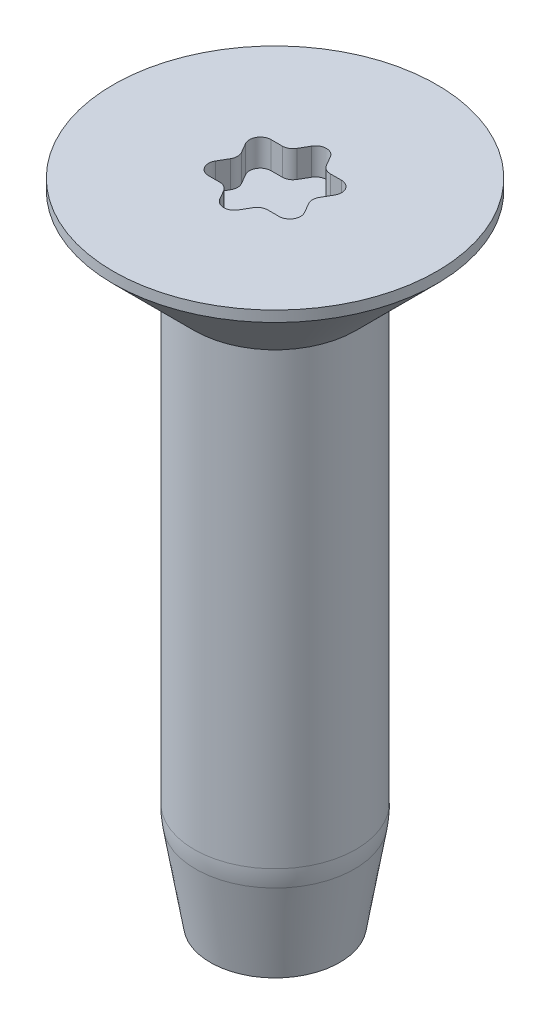
ISO-10303-21;
HEADER;
FILE_DESCRIPTION(('STEP AP214'),'2;1');
FILE_NAME('part.step','',(''),(''),'','','');
FILE_SCHEMA(('AUTOMOTIVE_DESIGN { 1 0 10303 214 1 1 1 1 }'));
ENDSEC;
DATA;
#1=APPLICATION_CONTEXT('core data for automotive mechanical design processes');
#2=APPLICATION_PROTOCOL_DEFINITION('international standard','automotive_design',2000,#1);
#3=PRODUCT_CONTEXT('',#1,'mechanical');
#4=PRODUCT('Part','Part','',(#3));
#5=PRODUCT_RELATED_PRODUCT_CATEGORY('part','',(#4));
#6=PRODUCT_DEFINITION_FORMATION('','',#4);
#7=PRODUCT_DEFINITION_CONTEXT('part definition',#1,'design');
#8=PRODUCT_DEFINITION('design','',#6,#7);
#9=PRODUCT_DEFINITION_SHAPE('','',#8);
#10=(LENGTH_UNIT() NAMED_UNIT(*) SI_UNIT(.MILLI.,.METRE.));
#11=(NAMED_UNIT(*) PLANE_ANGLE_UNIT() SI_UNIT($,.RADIAN.));
#12=(NAMED_UNIT(*) SI_UNIT($,.STERADIAN.) SOLID_ANGLE_UNIT());
#13=UNCERTAINTY_MEASURE_WITH_UNIT(LENGTH_MEASURE(1.E-05),#10,'distance_accuracy_value','');
#14=(GEOMETRIC_REPRESENTATION_CONTEXT(3) GLOBAL_UNCERTAINTY_ASSIGNED_CONTEXT((#13)) GLOBAL_UNIT_ASSIGNED_CONTEXT((#10,
#11,#12)) REPRESENTATION_CONTEXT('',''));
#15=CARTESIAN_POINT('',(0.,0.,0.));
#16=DIRECTION('',(0.,0.,1.));
#17=DIRECTION('',(1.,0.,0.));
#18=AXIS2_PLACEMENT_3D('',#15,#16,#17);
#19=CARTESIAN_POINT('',(0.,-26.5426406871193,0.));
#20=DIRECTION('',(0.,1.,0.));
#21=DIRECTION('',(0.,0.,1.));
#22=AXIS2_PLACEMENT_3D('',#19,#20,#21);
#23=CYLINDRICAL_SURFACE('',#22,1.5);
#24=CARTESIAN_POINT('',(0.,-8.33447493940356,0.));
#25=DIRECTION('',(0.,-1.,0.));
#26=DIRECTION('',(1.,0.,0.));
#27=AXIS2_PLACEMENT_3D('',#24,#25,#26);
#28=CIRCLE('',#27,1.5);
#29=CARTESIAN_POINT('',(1.5,-8.33447493940356,0.));
#30=VERTEX_POINT('',#29);
#31=EDGE_CURVE('E43',#30,#30,#28,.F.);
#32=ORIENTED_EDGE('',*,*,#31,.T.);
#33=EDGE_LOOP('',(#32));
#34=FACE_BOUND('',#33,.T.);
#35=CARTESIAN_POINT('',(0.,0.,0.));
#36=DIRECTION('',(0.,-1.,0.));
#37=DIRECTION('',(0.,0.,-1.));
#38=AXIS2_PLACEMENT_3D('',#35,#36,#37);
#39=CIRCLE('',#38,1.5);
#40=CARTESIAN_POINT('',(0.,0.,-1.5));
#41=VERTEX_POINT('',#40);
#42=EDGE_CURVE('E238',#41,#41,#39,.T.);
#43=ORIENTED_EDGE('',*,*,#42,.T.);
#44=EDGE_LOOP('',(#43));
#45=FACE_BOUND('',#44,.T.);
#46=ADVANCED_FACE('F35',(#34,#45),#23,.T.);
#47=CARTESIAN_POINT('',(0.,1.7,0.));
#48=DIRECTION('',(0.,-1.,0.));
#49=DIRECTION('',(0.,0.,-1.));
#50=AXIS2_PLACEMENT_3D('',#47,#48,#49);
#51=PLANE('',#50);
#52=DIRECTION('',(0.5,0.,-0.866025403784439));
#53=VECTOR('',#52,1.);
#54=CARTESIAN_POINT('',(1.,1.7,-0.58));
#55=LINE('',#54,#53);
#56=CARTESIAN_POINT('',(0.72287187078898,1.7,-0.0999999999999997));
#57=VERTEX_POINT('',#56);
#58=CARTESIAN_POINT('',(0.826794919243113,1.7,-0.28));
#59=VERTEX_POINT('',#58);
#60=EDGE_CURVE('E226',#57,#59,#55,.T.);
#61=ORIENTED_EDGE('',*,*,#60,.F.);
#62=CARTESIAN_POINT('',(0.896076951545868,1.7,0.));
#63=DIRECTION('',(0.,-1.,0.));
#64=DIRECTION('',(0.,0.,-1.));
#65=AXIS2_PLACEMENT_3D('',#62,#63,#64);
#66=CIRCLE('',#65,0.2);
#67=CARTESIAN_POINT('',(0.72287187078898,1.7,0.1));
#68=VERTEX_POINT('',#67);
#69=EDGE_CURVE('E272',#57,#68,#66,.F.);
#70=ORIENTED_EDGE('',*,*,#69,.T.);
#71=DIRECTION('',(-0.5,0.,-0.866025403784439));
#72=VECTOR('',#71,1.);
#73=CARTESIAN_POINT('',(0.665136843870018,1.7,0.));
#74=LINE('',#73,#72);
#75=CARTESIAN_POINT('',(0.826794919243113,1.7,0.28));
#76=VERTEX_POINT('',#75);
#77=EDGE_CURVE('E231',#76,#68,#74,.T.);
#78=ORIENTED_EDGE('',*,*,#77,.F.);
#79=CARTESIAN_POINT('',(0.653589838486225,1.7,0.38));
#80=DIRECTION('',(0.,-1.,0.));
#81=DIRECTION('',(0.,0.,-1.));
#82=AXIS2_PLACEMENT_3D('',#79,#80,#81);
#83=CIRCLE('',#82,0.2);
#84=CARTESIAN_POINT('',(0.653589838486225,1.7,0.58));
#85=VERTEX_POINT('',#84);
#86=EDGE_CURVE('E323',#76,#85,#83,.T.);
#87=ORIENTED_EDGE('',*,*,#86,.T.);
#88=DIRECTION('',(1.,0.,0.));
#89=VECTOR('',#88,1.);
#90=CARTESIAN_POINT('',(0.330273687740034,1.7,0.58));
#91=LINE('',#90,#89);
#92=CARTESIAN_POINT('',(0.445743741577959,1.7,0.58));
#93=VERTEX_POINT('',#92);
#94=EDGE_CURVE('E483',#93,#85,#91,.T.);
#95=ORIENTED_EDGE('',*,*,#94,.F.);
#96=CARTESIAN_POINT('',(0.445743741577959,1.7,0.78));
#97=DIRECTION('',(0.,-1.,0.));
#98=DIRECTION('',(0.,0.,-1.));
#99=AXIS2_PLACEMENT_3D('',#96,#97,#98);
#100=CIRCLE('',#99,0.2);
#101=CARTESIAN_POINT('',(0.272538660821072,1.7,0.68));
#102=VERTEX_POINT('',#101);
#103=EDGE_CURVE('E270',#93,#102,#100,.F.);
#104=ORIENTED_EDGE('',*,*,#103,.T.);
#105=DIRECTION('',(0.499999999999999,0.,-0.866025403784439));
#106=VECTOR('',#105,1.);
#107=CARTESIAN_POINT('',(0.330273687740034,1.7,0.58));
#108=LINE('',#107,#106);
#109=CARTESIAN_POINT('',(0.173205080756888,1.7,0.852050807568877));
#110=VERTEX_POINT('',#109);
#111=EDGE_CURVE('E480',#110,#102,#108,.T.);
#112=ORIENTED_EDGE('',*,*,#111,.F.);
#113=CARTESIAN_POINT('',(0.,1.7,0.752050807568877));
#114=DIRECTION('',(0.,-1.,0.));
#115=DIRECTION('',(0.,0.,-1.));
#116=AXIS2_PLACEMENT_3D('',#113,#114,#115);
#117=CIRCLE('',#116,0.2);
#118=CARTESIAN_POINT('',(-0.173205080756887,1.7,0.852050807568877));
#119=VERTEX_POINT('',#118);
#120=EDGE_CURVE('E327',#110,#119,#117,.T.);
#121=ORIENTED_EDGE('',*,*,#120,.T.);
#122=DIRECTION('',(0.5,0.,0.866025403784439));
#123=VECTOR('',#122,1.);
#124=CARTESIAN_POINT('',(-0.330273687740034,1.7,0.58));
#125=LINE('',#124,#123);
#126=CARTESIAN_POINT('',(-0.272538660821071,1.7,0.68));
#127=VERTEX_POINT('',#126);
#128=EDGE_CURVE('E477',#127,#119,#125,.T.);
#129=ORIENTED_EDGE('',*,*,#128,.F.);
#130=CARTESIAN_POINT('',(-0.445743741577959,1.7,0.78));
#131=DIRECTION('',(0.,-1.,0.));
#132=DIRECTION('',(0.,0.,-1.));
#133=AXIS2_PLACEMENT_3D('',#130,#131,#132);
#134=CIRCLE('',#133,0.2);
#135=CARTESIAN_POINT('',(-0.445743741577959,1.7,0.58));
#136=VERTEX_POINT('',#135);
#137=EDGE_CURVE('E268',#127,#136,#134,.F.);
#138=ORIENTED_EDGE('',*,*,#137,.T.);
#139=DIRECTION('',(1.,0.,0.));
#140=VECTOR('',#139,1.);
#141=CARTESIAN_POINT('',(-1.,1.7,0.58));
#142=LINE('',#141,#140);
#143=CARTESIAN_POINT('',(-0.653589838486224,1.7,0.58));
#144=VERTEX_POINT('',#143);
#145=EDGE_CURVE('E474',#144,#136,#142,.T.);
#146=ORIENTED_EDGE('',*,*,#145,.F.);
#147=CARTESIAN_POINT('',(-0.653589838486224,1.7,0.38));
#148=DIRECTION('',(0.,-1.,0.));
#149=DIRECTION('',(0.,0.,-1.));
#150=AXIS2_PLACEMENT_3D('',#147,#148,#149);
#151=CIRCLE('',#150,0.2);
#152=CARTESIAN_POINT('',(-0.826794919243112,1.7,0.28));
#153=VERTEX_POINT('',#152);
#154=EDGE_CURVE('E331',#144,#153,#151,.T.);
#155=ORIENTED_EDGE('',*,*,#154,.T.);
#156=DIRECTION('',(-0.5,0.,0.866025403784439));
#157=VECTOR('',#156,1.);
#158=CARTESIAN_POINT('',(-0.665136843870017,1.7,0.));
#159=LINE('',#158,#157);
#160=CARTESIAN_POINT('',(-0.722871870788979,1.7,0.0999999999999998));
#161=VERTEX_POINT('',#160);
#162=EDGE_CURVE('E471',#161,#153,#159,.T.);
#163=ORIENTED_EDGE('',*,*,#162,.F.);
#164=CARTESIAN_POINT('',(-0.896076951545867,1.7,0.));
#165=DIRECTION('',(0.,-1.,0.));
#166=DIRECTION('',(0.,0.,-1.));
#167=AXIS2_PLACEMENT_3D('',#164,#165,#166);
#168=CIRCLE('',#167,0.2);
#169=CARTESIAN_POINT('',(-0.722871870788979,1.7,-0.1));
#170=VERTEX_POINT('',#169);
#171=EDGE_CURVE('E50',#161,#170,#168,.F.);
#172=ORIENTED_EDGE('',*,*,#171,.T.);
#173=DIRECTION('',(0.5,0.,0.866025403784439));
#174=VECTOR('',#173,1.);
#175=CARTESIAN_POINT('',(-0.999999999999999,1.7,-0.58));
#176=LINE('',#175,#174);
#177=CARTESIAN_POINT('',(-0.826794919243112,1.7,-0.28));
#178=VERTEX_POINT('',#177);
#179=EDGE_CURVE('E469',#178,#170,#176,.T.);
#180=ORIENTED_EDGE('',*,*,#179,.F.);
#181=CARTESIAN_POINT('',(-0.653589838486224,1.7,-0.38));
#182=DIRECTION('',(0.,-1.,0.));
#183=DIRECTION('',(0.,0.,-1.));
#184=AXIS2_PLACEMENT_3D('',#181,#182,#183);
#185=CIRCLE('',#184,0.2);
#186=CARTESIAN_POINT('',(-0.653589838486224,1.7,-0.58));
#187=VERTEX_POINT('',#186);
#188=EDGE_CURVE('E58',#178,#187,#185,.T.);
#189=ORIENTED_EDGE('',*,*,#188,.T.);
#190=DIRECTION('',(-1.,0.,0.));
#191=VECTOR('',#190,1.);
#192=CARTESIAN_POINT('',(-0.999999999999999,1.7,-0.58));
#193=LINE('',#192,#191);
#194=CARTESIAN_POINT('',(-0.44574374157796,1.7,-0.58));
#195=VERTEX_POINT('',#194);
#196=EDGE_CURVE('E466',#195,#187,#193,.T.);
#197=ORIENTED_EDGE('',*,*,#196,.F.);
#198=CARTESIAN_POINT('',(-0.445743741577959,1.7,-0.78));
#199=DIRECTION('',(0.,-1.,0.));
#200=DIRECTION('',(0.,0.,-1.));
#201=AXIS2_PLACEMENT_3D('',#198,#199,#200);
#202=CIRCLE('',#201,0.2);
#203=CARTESIAN_POINT('',(-0.272538660821072,1.7,-0.68));
#204=VERTEX_POINT('',#203);
#205=EDGE_CURVE('E264',#195,#204,#202,.F.);
#206=ORIENTED_EDGE('',*,*,#205,.T.);
#207=DIRECTION('',(-0.5,0.,0.866025403784439));
#208=VECTOR('',#207,1.);
#209=CARTESIAN_POINT('',(0.,1.7,-1.15205080756888));
#210=LINE('',#209,#208);
#211=CARTESIAN_POINT('',(-0.173205080756888,1.7,-0.852050807568877));
#212=VERTEX_POINT('',#211);
#213=EDGE_CURVE('E464',#212,#204,#210,.T.);
#214=ORIENTED_EDGE('',*,*,#213,.F.);
#215=CARTESIAN_POINT('',(0.,1.7,-0.752050807568877));
#216=DIRECTION('',(0.,-1.,0.));
#217=DIRECTION('',(0.,0.,-1.));
#218=AXIS2_PLACEMENT_3D('',#215,#216,#217);
#219=CIRCLE('',#218,0.2);
#220=CARTESIAN_POINT('',(0.173205080756888,1.7,-0.852050807568877));
#221=VERTEX_POINT('',#220);
#222=EDGE_CURVE('E338',#212,#221,#219,.T.);
#223=ORIENTED_EDGE('',*,*,#222,.T.);
#224=DIRECTION('',(-0.5,0.,-0.866025403784439));
#225=VECTOR('',#224,1.);
#226=CARTESIAN_POINT('',(0.,1.7,-1.15205080756888));
#227=LINE('',#226,#225);
#228=CARTESIAN_POINT('',(0.272538660821072,1.7,-0.68));
#229=VERTEX_POINT('',#228);
#230=EDGE_CURVE('E225',#229,#221,#227,.T.);
#231=ORIENTED_EDGE('',*,*,#230,.F.);
#232=CARTESIAN_POINT('',(0.445743741577959,1.7,-0.78));
#233=DIRECTION('',(0.,-1.,0.));
#234=DIRECTION('',(0.,0.,-1.));
#235=AXIS2_PLACEMENT_3D('',#232,#233,#234);
#236=CIRCLE('',#235,0.2);
#237=CARTESIAN_POINT('',(0.445743741577959,1.7,-0.58));
#238=VERTEX_POINT('',#237);
#239=EDGE_CURVE('E224',#229,#238,#236,.F.);
#240=ORIENTED_EDGE('',*,*,#239,.T.);
#241=DIRECTION('',(-1.,0.,0.));
#242=VECTOR('',#241,1.);
#243=CARTESIAN_POINT('',(0.330273687740034,1.7,-0.58));
#244=LINE('',#243,#242);
#245=CARTESIAN_POINT('',(0.653589838486225,1.7,-0.58));
#246=VERTEX_POINT('',#245);
#247=EDGE_CURVE('E214',#246,#238,#244,.T.);
#248=ORIENTED_EDGE('',*,*,#247,.F.);
#249=CARTESIAN_POINT('',(0.653589838486225,1.7,-0.38));
#250=DIRECTION('',(0.,-1.,0.));
#251=DIRECTION('',(0.,0.,-1.));
#252=AXIS2_PLACEMENT_3D('',#249,#250,#251);
#253=CIRCLE('',#252,0.2);
#254=EDGE_CURVE('E198',#246,#59,#253,.T.);
#255=ORIENTED_EDGE('',*,*,#254,.T.);
#256=EDGE_LOOP('',(#61,#70,#78,#87,#95,#104,#112,#121,#129,#138,#146,#155,#163,#172,#180,#189,
#197,#206,#214,#223,#231,#240,#248,#255));
#257=FACE_BOUND('',#256,.T.);
#258=CARTESIAN_POINT('',(0.,1.7,0.));
#259=DIRECTION('',(0.,1.,0.));
#260=DIRECTION('',(0.,0.,1.));
#261=AXIS2_PLACEMENT_3D('',#258,#259,#260);
#262=CIRCLE('',#261,3.);
#263=CARTESIAN_POINT('',(0.,1.7,3.));
#264=VERTEX_POINT('',#263);
#265=EDGE_CURVE('E245',#264,#264,#262,.T.);
#266=ORIENTED_EDGE('',*,*,#265,.T.);
#267=EDGE_LOOP('',(#266));
#268=FACE_BOUND('',#267,.T.);
#269=ADVANCED_FACE('F221',(#257,#268),#51,.F.);
#270=CARTESIAN_POINT('',(0.,50.,0.));
#271=DIRECTION('',(0.,1.,0.));
#272=DIRECTION('',(0.,0.,1.));
#273=AXIS2_PLACEMENT_3D('',#270,#271,#272);
#274=CYLINDRICAL_SURFACE('',#273,3.);
#275=ORIENTED_EDGE('',*,*,#265,.F.);
#276=EDGE_LOOP('',(#275));
#277=FACE_BOUND('',#276,.T.);
#278=CARTESIAN_POINT('',(0.,1.50000000000002,0.));
#279=DIRECTION('',(0.,1.,0.));
#280=DIRECTION('',(0.,0.,1.));
#281=AXIS2_PLACEMENT_3D('',#278,#279,#280);
#282=CIRCLE('',#281,3.);
#283=CARTESIAN_POINT('',(0.,1.50000000000002,3.));
#284=VERTEX_POINT('',#283);
#285=EDGE_CURVE('E242',#284,#284,#282,.T.);
#286=ORIENTED_EDGE('',*,*,#285,.T.);
#287=EDGE_LOOP('',(#286));
#288=FACE_BOUND('',#287,.T.);
#289=ADVANCED_FACE('F360',(#277,#288),#274,.T.);
#290=CARTESIAN_POINT('',(0.,0.,0.));
#291=DIRECTION('',(0.,1.,0.));
#292=DIRECTION('',(0.,0.,1.));
#293=AXIS2_PLACEMENT_3D('',#290,#291,#292);
#294=CONICAL_SURFACE('',#293,1.5,0.785398163397443);
#295=ORIENTED_EDGE('',*,*,#285,.F.);
#296=EDGE_LOOP('',(#295));
#297=FACE_BOUND('',#296,.T.);
#298=ORIENTED_EDGE('',*,*,#42,.F.);
#299=EDGE_LOOP('',(#298));
#300=FACE_BOUND('',#299,.T.);
#301=ADVANCED_FACE('F371',(#297,#300),#294,.T.);
#302=CARTESIAN_POINT('',(0.,-8.5,0.));
#303=DIRECTION('',(0.,1.,0.));
#304=DIRECTION('',(-1.,0.,0.));
#305=AXIS2_PLACEMENT_3D('',#302,#303,#304);
#306=CONICAL_SURFACE('',#305,1.5,0.165148677414627);
#307=CARTESIAN_POINT('',(0.,-8.66327291401428,0.));
#308=DIRECTION('',(0.,1.,0.));
#309=DIRECTION('',(-1.,0.,0.));
#310=AXIS2_PLACEMENT_3D('',#307,#308,#309);
#311=CIRCLE('',#310,1.47278784766429);
#312=CARTESIAN_POINT('',(-1.47278784766429,-8.66327291401428,0.));
#313=VERTEX_POINT('',#312);
#314=EDGE_CURVE('E12',#313,#313,#311,.F.);
#315=ORIENTED_EDGE('',*,*,#314,.T.);
#316=EDGE_LOOP('',(#315));
#317=FACE_BOUND('',#316,.T.);
#318=CARTESIAN_POINT('',(0.,-10.3,0.));
#319=DIRECTION('',(0.,1.,0.));
#320=DIRECTION('',(-1.,0.,0.));
#321=AXIS2_PLACEMENT_3D('',#318,#319,#320);
#322=CIRCLE('',#321,1.2);
#323=CARTESIAN_POINT('',(-1.2,-10.3,0.));
#324=VERTEX_POINT('',#323);
#325=EDGE_CURVE('E235',#324,#324,#322,.T.);
#326=ORIENTED_EDGE('',*,*,#325,.T.);
#327=EDGE_LOOP('',(#326));
#328=FACE_BOUND('',#327,.T.);
#329=ADVANCED_FACE('F364',(#317,#328),#306,.T.);
#330=CARTESIAN_POINT('',(0.,-10.3,0.));
#331=DIRECTION('',(0.,-1.,0.));
#332=DIRECTION('',(0.,0.,-1.));
#333=AXIS2_PLACEMENT_3D('',#330,#331,#332);
#334=PLANE('',#333);
#335=ORIENTED_EDGE('',*,*,#325,.F.);
#336=EDGE_LOOP('',(#335));
#337=FACE_BOUND('',#336,.T.);
#338=ADVANCED_FACE('F366',(#337),#334,.T.);
#339=CARTESIAN_POINT('',(0.,1.2,-1.15205080756888));
#340=DIRECTION('',(-0.866025403784439,0.,-0.5));
#341=DIRECTION('',(-0.5,0.,0.866025403784439));
#342=AXIS2_PLACEMENT_3D('',#339,#340,#341);
#343=PLANE('',#342);
#344=DIRECTION('',(-0.5,0.,0.866025403784439));
#345=VECTOR('',#344,1.);
#346=CARTESIAN_POINT('',(0.,1.2,-1.15205080756888));
#347=LINE('',#346,#345);
#348=CARTESIAN_POINT('',(-0.173205080756888,1.2,-0.852050807568877));
#349=VERTEX_POINT('',#348);
#350=CARTESIAN_POINT('',(-0.272538660821072,1.2,-0.68));
#351=VERTEX_POINT('',#350);
#352=EDGE_CURVE('E229',#349,#351,#347,.T.);
#353=ORIENTED_EDGE('',*,*,#352,.F.);
#354=DIRECTION('',(0.,1.,0.));
#355=VECTOR('',#354,1.);
#356=CARTESIAN_POINT('',(-0.173205080756888,1.7,-0.852050807568877));
#357=LINE('',#356,#355);
#358=EDGE_CURVE('E208',#349,#212,#357,.T.);
#359=ORIENTED_EDGE('',*,*,#358,.T.);
#360=ORIENTED_EDGE('',*,*,#213,.T.);
#361=DIRECTION('',(0.,1.,0.));
#362=VECTOR('',#361,1.);
#363=CARTESIAN_POINT('',(-0.272538660821072,1.2,-0.68));
#364=LINE('',#363,#362);
#365=EDGE_CURVE('E318',#204,#351,#364,.F.);
#366=ORIENTED_EDGE('',*,*,#365,.T.);
#367=EDGE_LOOP('',(#353,#359,#360,#366));
#368=FACE_BOUND('',#367,.T.);
#369=ADVANCED_FACE('F369',(#368),#343,.F.);
#370=CARTESIAN_POINT('',(0.,1.2,-1.15205080756888));
#371=DIRECTION('',(0.866025403784439,0.,-0.5));
#372=DIRECTION('',(-0.5,0.,-0.866025403784439));
#373=AXIS2_PLACEMENT_3D('',#370,#371,#372);
#374=PLANE('',#373);
#375=DIRECTION('',(-0.5,0.,-0.866025403784439));
#376=VECTOR('',#375,1.);
#377=CARTESIAN_POINT('',(0.,1.2,-1.15205080756888));
#378=LINE('',#377,#376);
#379=CARTESIAN_POINT('',(0.272538660821072,1.2,-0.68));
#380=VERTEX_POINT('',#379);
#381=CARTESIAN_POINT('',(0.173205080756888,1.2,-0.852050807568877));
#382=VERTEX_POINT('',#381);
#383=EDGE_CURVE('E239',#380,#382,#378,.T.);
#384=ORIENTED_EDGE('',*,*,#383,.F.);
#385=DIRECTION('',(0.,1.,0.));
#386=VECTOR('',#385,1.);
#387=CARTESIAN_POINT('',(0.272538660821072,1.2,-0.68));
#388=LINE('',#387,#386);
#389=EDGE_CURVE('E315',#380,#229,#388,.T.);
#390=ORIENTED_EDGE('',*,*,#389,.T.);
#391=ORIENTED_EDGE('',*,*,#230,.T.);
#392=DIRECTION('',(0.,1.,0.));
#393=VECTOR('',#392,1.);
#394=CARTESIAN_POINT('',(0.173205080756888,1.2,-0.852050807568877));
#395=LINE('',#394,#393);
#396=EDGE_CURVE('E313',#221,#382,#395,.F.);
#397=ORIENTED_EDGE('',*,*,#396,.T.);
#398=EDGE_LOOP('',(#384,#390,#391,#397));
#399=FACE_BOUND('',#398,.T.);
#400=ADVANCED_FACE('F505',(#399),#374,.F.);
#401=CARTESIAN_POINT('',(0.330273687740034,1.2,-0.58));
#402=DIRECTION('',(0.,0.,-1.));
#403=DIRECTION('',(-1.,0.,0.));
#404=AXIS2_PLACEMENT_3D('',#401,#402,#403);
#405=PLANE('',#404);
#406=DIRECTION('',(-1.,0.,0.));
#407=VECTOR('',#406,1.);
#408=CARTESIAN_POINT('',(0.330273687740034,1.2,-0.58));
#409=LINE('',#408,#407);
#410=CARTESIAN_POINT('',(0.653589838486225,1.2,-0.58));
#411=VERTEX_POINT('',#410);
#412=CARTESIAN_POINT('',(0.445743741577959,1.2,-0.58));
#413=VERTEX_POINT('',#412);
#414=EDGE_CURVE('E217',#411,#413,#409,.T.);
#415=ORIENTED_EDGE('',*,*,#414,.F.);
#416=DIRECTION('',(0.,1.,0.));
#417=VECTOR('',#416,1.);
#418=CARTESIAN_POINT('',(0.653589838486225,1.7,-0.58));
#419=LINE('',#418,#417);
#420=EDGE_CURVE('E202',#411,#246,#419,.T.);
#421=ORIENTED_EDGE('',*,*,#420,.T.);
#422=ORIENTED_EDGE('',*,*,#247,.T.);
#423=DIRECTION('',(0.,1.,0.));
#424=VECTOR('',#423,1.);
#425=CARTESIAN_POINT('',(0.445743741577959,1.2,-0.58));
#426=LINE('',#425,#424);
#427=EDGE_CURVE('E219',#238,#413,#426,.F.);
#428=ORIENTED_EDGE('',*,*,#427,.T.);
#429=EDGE_LOOP('',(#415,#421,#422,#428));
#430=FACE_BOUND('',#429,.T.);
#431=ADVANCED_FACE('F213',(#430),#405,.F.);
#432=CARTESIAN_POINT('',(1.,1.2,-0.58));
#433=DIRECTION('',(0.866025403784439,0.,0.5));
#434=DIRECTION('',(0.5,0.,-0.866025403784439));
#435=AXIS2_PLACEMENT_3D('',#432,#433,#434);
#436=PLANE('',#435);
#437=ORIENTED_EDGE('',*,*,#60,.T.);
#438=DIRECTION('',(0.,1.,0.));
#439=VECTOR('',#438,1.);
#440=CARTESIAN_POINT('',(0.826794919243113,1.2,-0.28));
#441=LINE('',#440,#439);
#442=CARTESIAN_POINT('',(0.826794919243113,1.2,-0.28));
#443=VERTEX_POINT('',#442);
#444=EDGE_CURVE('E203',#59,#443,#441,.F.);
#445=ORIENTED_EDGE('',*,*,#444,.T.);
#446=DIRECTION('',(0.5,0.,-0.866025403784439));
#447=VECTOR('',#446,1.);
#448=CARTESIAN_POINT('',(1.,1.2,-0.58));
#449=LINE('',#448,#447);
#450=CARTESIAN_POINT('',(0.72287187078898,1.2,-0.0999999999999997));
#451=VERTEX_POINT('',#450);
#452=EDGE_CURVE('E460',#451,#443,#449,.T.);
#453=ORIENTED_EDGE('',*,*,#452,.F.);
#454=DIRECTION('',(0.,1.,0.));
#455=VECTOR('',#454,1.);
#456=CARTESIAN_POINT('',(0.72287187078898,1.2,-0.0999999999999998));
#457=LINE('',#456,#455);
#458=EDGE_CURVE('E218',#451,#57,#457,.T.);
#459=ORIENTED_EDGE('',*,*,#458,.T.);
#460=EDGE_LOOP('',(#437,#445,#453,#459));
#461=FACE_BOUND('',#460,.T.);
#462=ADVANCED_FACE('F496',(#461),#436,.F.);
#463=CARTESIAN_POINT('',(0.665136843870018,1.2,0.));
#464=DIRECTION('',(0.866025403784439,0.,-0.5));
#465=DIRECTION('',(-0.5,0.,-0.866025403784439));
#466=AXIS2_PLACEMENT_3D('',#463,#464,#465);
#467=PLANE('',#466);
#468=ORIENTED_EDGE('',*,*,#77,.T.);
#469=DIRECTION('',(0.,1.,0.));
#470=VECTOR('',#469,1.);
#471=CARTESIAN_POINT('',(0.72287187078898,1.2,0.1));
#472=LINE('',#471,#470);
#473=CARTESIAN_POINT('',(0.72287187078898,1.2,0.1));
#474=VERTEX_POINT('',#473);
#475=EDGE_CURVE('E277',#68,#474,#472,.F.);
#476=ORIENTED_EDGE('',*,*,#475,.T.);
#477=DIRECTION('',(-0.5,0.,-0.866025403784439));
#478=VECTOR('',#477,1.);
#479=CARTESIAN_POINT('',(0.665136843870018,1.2,0.));
#480=LINE('',#479,#478);
#481=CARTESIAN_POINT('',(0.826794919243113,1.2,0.28));
#482=VERTEX_POINT('',#481);
#483=EDGE_CURVE('E457',#482,#474,#480,.T.);
#484=ORIENTED_EDGE('',*,*,#483,.F.);
#485=DIRECTION('',(0.,1.,0.));
#486=VECTOR('',#485,1.);
#487=CARTESIAN_POINT('',(0.826794919243113,1.7,0.28));
#488=LINE('',#487,#486);
#489=EDGE_CURVE('E274',#482,#76,#488,.T.);
#490=ORIENTED_EDGE('',*,*,#489,.T.);
#491=EDGE_LOOP('',(#468,#476,#484,#490));
#492=FACE_BOUND('',#491,.T.);
#493=ADVANCED_FACE('F489',(#492),#467,.F.);
#494=CARTESIAN_POINT('',(0.330273687740034,1.2,0.58));
#495=DIRECTION('',(0.,0.,1.));
#496=DIRECTION('',(1.,0.,0.));
#497=AXIS2_PLACEMENT_3D('',#494,#495,#496);
#498=PLANE('',#497);
#499=ORIENTED_EDGE('',*,*,#94,.T.);
#500=DIRECTION('',(0.,1.,0.));
#501=VECTOR('',#500,1.);
#502=CARTESIAN_POINT('',(0.653589838486225,1.2,0.58));
#503=LINE('',#502,#501);
#504=CARTESIAN_POINT('',(0.653589838486225,1.2,0.58));
#505=VERTEX_POINT('',#504);
#506=EDGE_CURVE('E282',#85,#505,#503,.F.);
#507=ORIENTED_EDGE('',*,*,#506,.T.);
#508=DIRECTION('',(1.,0.,0.));
#509=VECTOR('',#508,1.);
#510=CARTESIAN_POINT('',(0.330273687740034,1.2,0.58));
#511=LINE('',#510,#509);
#512=CARTESIAN_POINT('',(0.445743741577959,1.2,0.58));
#513=VERTEX_POINT('',#512);
#514=EDGE_CURVE('E454',#513,#505,#511,.T.);
#515=ORIENTED_EDGE('',*,*,#514,.F.);
#516=DIRECTION('',(0.,1.,0.));
#517=VECTOR('',#516,1.);
#518=CARTESIAN_POINT('',(0.445743741577959,1.2,0.58));
#519=LINE('',#518,#517);
#520=EDGE_CURVE('E279',#513,#93,#519,.T.);
#521=ORIENTED_EDGE('',*,*,#520,.T.);
#522=EDGE_LOOP('',(#499,#507,#515,#521));
#523=FACE_BOUND('',#522,.T.);
#524=ADVANCED_FACE('F503',(#523),#498,.F.);
#525=CARTESIAN_POINT('',(0.330273687740034,1.2,0.58));
#526=DIRECTION('',(0.866025403784439,0.,0.499999999999999));
#527=DIRECTION('',(0.499999999999999,0.,-0.866025403784439));
#528=AXIS2_PLACEMENT_3D('',#525,#526,#527);
#529=PLANE('',#528);
#530=ORIENTED_EDGE('',*,*,#111,.T.);
#531=DIRECTION('',(0.,1.,0.));
#532=VECTOR('',#531,1.);
#533=CARTESIAN_POINT('',(0.272538660821072,1.2,0.68));
#534=LINE('',#533,#532);
#535=CARTESIAN_POINT('',(0.272538660821072,1.2,0.68));
#536=VERTEX_POINT('',#535);
#537=EDGE_CURVE('E287',#102,#536,#534,.F.);
#538=ORIENTED_EDGE('',*,*,#537,.T.);
#539=DIRECTION('',(0.499999999999999,0.,-0.866025403784439));
#540=VECTOR('',#539,1.);
#541=CARTESIAN_POINT('',(0.330273687740034,1.2,0.58));
#542=LINE('',#541,#540);
#543=CARTESIAN_POINT('',(0.173205080756888,1.2,0.852050807568877));
#544=VERTEX_POINT('',#543);
#545=EDGE_CURVE('E451',#544,#536,#542,.T.);
#546=ORIENTED_EDGE('',*,*,#545,.F.);
#547=DIRECTION('',(0.,1.,0.));
#548=VECTOR('',#547,1.);
#549=CARTESIAN_POINT('',(0.173205080756888,1.7,0.852050807568877));
#550=LINE('',#549,#548);
#551=EDGE_CURVE('E284',#544,#110,#550,.T.);
#552=ORIENTED_EDGE('',*,*,#551,.T.);
#553=EDGE_LOOP('',(#530,#538,#546,#552));
#554=FACE_BOUND('',#553,.T.);
#555=ADVANCED_FACE('F511',(#554),#529,.F.);
#556=CARTESIAN_POINT('',(-0.330273687740034,1.2,0.58));
#557=DIRECTION('',(-0.866025403784439,0.,0.5));
#558=DIRECTION('',(0.5,0.,0.866025403784439));
#559=AXIS2_PLACEMENT_3D('',#556,#557,#558);
#560=PLANE('',#559);
#561=ORIENTED_EDGE('',*,*,#128,.T.);
#562=DIRECTION('',(0.,1.,0.));
#563=VECTOR('',#562,1.);
#564=CARTESIAN_POINT('',(-0.173205080756887,1.2,0.852050807568877));
#565=LINE('',#564,#563);
#566=CARTESIAN_POINT('',(-0.173205080756887,1.2,0.852050807568877));
#567=VERTEX_POINT('',#566);
#568=EDGE_CURVE('E292',#119,#567,#565,.F.);
#569=ORIENTED_EDGE('',*,*,#568,.T.);
#570=DIRECTION('',(0.5,0.,0.866025403784439));
#571=VECTOR('',#570,1.);
#572=CARTESIAN_POINT('',(-0.330273687740034,1.2,0.58));
#573=LINE('',#572,#571);
#574=CARTESIAN_POINT('',(-0.272538660821071,1.2,0.68));
#575=VERTEX_POINT('',#574);
#576=EDGE_CURVE('E448',#575,#567,#573,.T.);
#577=ORIENTED_EDGE('',*,*,#576,.F.);
#578=DIRECTION('',(0.,1.,0.));
#579=VECTOR('',#578,1.);
#580=CARTESIAN_POINT('',(-0.272538660821071,1.2,0.68));
#581=LINE('',#580,#579);
#582=EDGE_CURVE('E289',#575,#127,#581,.T.);
#583=ORIENTED_EDGE('',*,*,#582,.T.);
#584=EDGE_LOOP('',(#561,#569,#577,#583));
#585=FACE_BOUND('',#584,.T.);
#586=ADVANCED_FACE('F515',(#585),#560,.F.);
#587=CARTESIAN_POINT('',(-1.,1.2,0.58));
#588=DIRECTION('',(0.,0.,1.));
#589=DIRECTION('',(1.,0.,0.));
#590=AXIS2_PLACEMENT_3D('',#587,#588,#589);
#591=PLANE('',#590);
#592=ORIENTED_EDGE('',*,*,#145,.T.);
#593=DIRECTION('',(0.,1.,0.));
#594=VECTOR('',#593,1.);
#595=CARTESIAN_POINT('',(-0.445743741577959,1.2,0.58));
#596=LINE('',#595,#594);
#597=CARTESIAN_POINT('',(-0.445743741577959,1.2,0.58));
#598=VERTEX_POINT('',#597);
#599=EDGE_CURVE('E297',#136,#598,#596,.F.);
#600=ORIENTED_EDGE('',*,*,#599,.T.);
#601=DIRECTION('',(1.,0.,0.));
#602=VECTOR('',#601,1.);
#603=CARTESIAN_POINT('',(-1.,1.2,0.58));
#604=LINE('',#603,#602);
#605=CARTESIAN_POINT('',(-0.653589838486224,1.2,0.58));
#606=VERTEX_POINT('',#605);
#607=EDGE_CURVE('E445',#606,#598,#604,.T.);
#608=ORIENTED_EDGE('',*,*,#607,.F.);
#609=DIRECTION('',(0.,1.,0.));
#610=VECTOR('',#609,1.);
#611=CARTESIAN_POINT('',(-0.653589838486224,1.7,0.58));
#612=LINE('',#611,#610);
#613=EDGE_CURVE('E294',#606,#144,#612,.T.);
#614=ORIENTED_EDGE('',*,*,#613,.T.);
#615=EDGE_LOOP('',(#592,#600,#608,#614));
#616=FACE_BOUND('',#615,.T.);
#617=ADVANCED_FACE('F519',(#616),#591,.F.);
#618=CARTESIAN_POINT('',(-0.665136843870017,1.2,0.));
#619=DIRECTION('',(-0.866025403784439,0.,-0.5));
#620=DIRECTION('',(-0.5,0.,0.866025403784439));
#621=AXIS2_PLACEMENT_3D('',#618,#619,#620);
#622=PLANE('',#621);
#623=ORIENTED_EDGE('',*,*,#162,.T.);
#624=DIRECTION('',(0.,1.,0.));
#625=VECTOR('',#624,1.);
#626=CARTESIAN_POINT('',(-0.826794919243112,1.2,0.28));
#627=LINE('',#626,#625);
#628=CARTESIAN_POINT('',(-0.826794919243112,1.2,0.28));
#629=VERTEX_POINT('',#628);
#630=EDGE_CURVE('E302',#153,#629,#627,.F.);
#631=ORIENTED_EDGE('',*,*,#630,.T.);
#632=DIRECTION('',(-0.5,0.,0.866025403784439));
#633=VECTOR('',#632,1.);
#634=CARTESIAN_POINT('',(-0.665136843870017,1.2,0.));
#635=LINE('',#634,#633);
#636=CARTESIAN_POINT('',(-0.722871870788979,1.2,0.0999999999999998));
#637=VERTEX_POINT('',#636);
#638=EDGE_CURVE('E442',#637,#629,#635,.T.);
#639=ORIENTED_EDGE('',*,*,#638,.F.);
#640=DIRECTION('',(0.,1.,0.));
#641=VECTOR('',#640,1.);
#642=CARTESIAN_POINT('',(-0.722871870788979,1.2,0.0999999999999998));
#643=LINE('',#642,#641);
#644=EDGE_CURVE('E299',#637,#161,#643,.T.);
#645=ORIENTED_EDGE('',*,*,#644,.T.);
#646=EDGE_LOOP('',(#623,#631,#639,#645));
#647=FACE_BOUND('',#646,.T.);
#648=ADVANCED_FACE('F523',(#647),#622,.F.);
#649=CARTESIAN_POINT('',(-0.999999999999999,1.2,-0.58));
#650=DIRECTION('',(-0.866025403784439,0.,0.5));
#651=DIRECTION('',(0.5,0.,0.866025403784439));
#652=AXIS2_PLACEMENT_3D('',#649,#650,#651);
#653=PLANE('',#652);
#654=ORIENTED_EDGE('',*,*,#179,.T.);
#655=DIRECTION('',(0.,1.,0.));
#656=VECTOR('',#655,1.);
#657=CARTESIAN_POINT('',(-0.722871870788979,1.2,-0.1));
#658=LINE('',#657,#656);
#659=CARTESIAN_POINT('',(-0.722871870788979,1.2,-0.1));
#660=VERTEX_POINT('',#659);
#661=EDGE_CURVE('E306',#170,#660,#658,.F.);
#662=ORIENTED_EDGE('',*,*,#661,.T.);
#663=DIRECTION('',(0.5,0.,0.866025403784439));
#664=VECTOR('',#663,1.);
#665=CARTESIAN_POINT('',(-0.999999999999999,1.2,-0.58));
#666=LINE('',#665,#664);
#667=CARTESIAN_POINT('',(-0.826794919243112,1.2,-0.28));
#668=VERTEX_POINT('',#667);
#669=EDGE_CURVE('E437',#668,#660,#666,.T.);
#670=ORIENTED_EDGE('',*,*,#669,.F.);
#671=DIRECTION('',(0.,1.,0.));
#672=VECTOR('',#671,1.);
#673=CARTESIAN_POINT('',(-0.826794919243112,1.7,-0.28));
#674=LINE('',#673,#672);
#675=EDGE_CURVE('E304',#668,#178,#674,.T.);
#676=ORIENTED_EDGE('',*,*,#675,.T.);
#677=EDGE_LOOP('',(#654,#662,#670,#676));
#678=FACE_BOUND('',#677,.T.);
#679=ADVANCED_FACE('F527',(#678),#653,.F.);
#680=CARTESIAN_POINT('',(-0.999999999999999,1.2,-0.58));
#681=DIRECTION('',(0.,0.,-1.));
#682=DIRECTION('',(-1.,0.,0.));
#683=AXIS2_PLACEMENT_3D('',#680,#681,#682);
#684=PLANE('',#683);
#685=ORIENTED_EDGE('',*,*,#196,.T.);
#686=DIRECTION('',(0.,1.,0.));
#687=VECTOR('',#686,1.);
#688=CARTESIAN_POINT('',(-0.653589838486224,1.2,-0.58));
#689=LINE('',#688,#687);
#690=CARTESIAN_POINT('',(-0.653589838486224,1.2,-0.58));
#691=VERTEX_POINT('',#690);
#692=EDGE_CURVE('E311',#187,#691,#689,.F.);
#693=ORIENTED_EDGE('',*,*,#692,.T.);
#694=DIRECTION('',(-1.,0.,0.));
#695=VECTOR('',#694,1.);
#696=CARTESIAN_POINT('',(-0.999999999999999,1.2,-0.58));
#697=LINE('',#696,#695);
#698=CARTESIAN_POINT('',(-0.44574374157796,1.2,-0.58));
#699=VERTEX_POINT('',#698);
#700=EDGE_CURVE('E434',#699,#691,#697,.T.);
#701=ORIENTED_EDGE('',*,*,#700,.F.);
#702=DIRECTION('',(0.,1.,0.));
#703=VECTOR('',#702,1.);
#704=CARTESIAN_POINT('',(-0.44574374157796,1.2,-0.58));
#705=LINE('',#704,#703);
#706=EDGE_CURVE('E308',#699,#195,#705,.T.);
#707=ORIENTED_EDGE('',*,*,#706,.T.);
#708=EDGE_LOOP('',(#685,#693,#701,#707));
#709=FACE_BOUND('',#708,.T.);
#710=ADVANCED_FACE('F531',(#709),#684,.F.);
#711=CARTESIAN_POINT('',(0.,1.2,0.));
#712=DIRECTION('',(0.,1.,0.));
#713=DIRECTION('',(0.,0.,1.));
#714=AXIS2_PLACEMENT_3D('',#711,#712,#713);
#715=PLANE('',#714);
#716=ORIENTED_EDGE('',*,*,#452,.T.);
#717=CARTESIAN_POINT('',(0.653589838486225,1.2,-0.38));
#718=DIRECTION('',(0.,1.,0.));
#719=DIRECTION('',(0.,0.,1.));
#720=AXIS2_PLACEMENT_3D('',#717,#718,#719);
#721=CIRCLE('',#720,0.2);
#722=EDGE_CURVE('E262',#443,#411,#721,.T.);
#723=ORIENTED_EDGE('',*,*,#722,.T.);
#724=ORIENTED_EDGE('',*,*,#414,.T.);
#725=CARTESIAN_POINT('',(0.445743741577959,1.2,-0.78));
#726=DIRECTION('',(0.,1.,0.));
#727=DIRECTION('',(0.,0.,1.));
#728=AXIS2_PLACEMENT_3D('',#725,#726,#727);
#729=CIRCLE('',#728,0.2);
#730=EDGE_CURVE('E336',#413,#380,#729,.F.);
#731=ORIENTED_EDGE('',*,*,#730,.T.);
#732=ORIENTED_EDGE('',*,*,#383,.T.);
#733=CARTESIAN_POINT('',(0.,1.2,-0.752050807568877));
#734=DIRECTION('',(0.,1.,0.));
#735=DIRECTION('',(0.,0.,1.));
#736=AXIS2_PLACEMENT_3D('',#733,#734,#735);
#737=CIRCLE('',#736,0.2);
#738=EDGE_CURVE('E252',#382,#349,#737,.T.);
#739=ORIENTED_EDGE('',*,*,#738,.T.);
#740=ORIENTED_EDGE('',*,*,#352,.T.);
#741=CARTESIAN_POINT('',(-0.445743741577959,1.2,-0.78));
#742=DIRECTION('',(0.,1.,0.));
#743=DIRECTION('',(0.,0.,1.));
#744=AXIS2_PLACEMENT_3D('',#741,#742,#743);
#745=CIRCLE('',#744,0.2);
#746=EDGE_CURVE('E340',#351,#699,#745,.F.);
#747=ORIENTED_EDGE('',*,*,#746,.T.);
#748=ORIENTED_EDGE('',*,*,#700,.T.);
#749=CARTESIAN_POINT('',(-0.653589838486224,1.2,-0.38));
#750=DIRECTION('',(0.,1.,0.));
#751=DIRECTION('',(0.,0.,1.));
#752=AXIS2_PLACEMENT_3D('',#749,#750,#751);
#753=CIRCLE('',#752,0.2);
#754=EDGE_CURVE('E254',#691,#668,#753,.T.);
#755=ORIENTED_EDGE('',*,*,#754,.T.);
#756=ORIENTED_EDGE('',*,*,#669,.T.);
#757=CARTESIAN_POINT('',(-0.896076951545867,1.2,0.));
#758=DIRECTION('',(0.,1.,0.));
#759=DIRECTION('',(0.,0.,1.));
#760=AXIS2_PLACEMENT_3D('',#757,#758,#759);
#761=CIRCLE('',#760,0.2);
#762=EDGE_CURVE('E333',#660,#637,#761,.F.);
#763=ORIENTED_EDGE('',*,*,#762,.T.);
#764=ORIENTED_EDGE('',*,*,#638,.T.);
#765=CARTESIAN_POINT('',(-0.653589838486224,1.2,0.38));
#766=DIRECTION('',(0.,1.,0.));
#767=DIRECTION('',(0.,0.,1.));
#768=AXIS2_PLACEMENT_3D('',#765,#766,#767);
#769=CIRCLE('',#768,0.2);
#770=EDGE_CURVE('E256',#629,#606,#769,.T.);
#771=ORIENTED_EDGE('',*,*,#770,.T.);
#772=ORIENTED_EDGE('',*,*,#607,.T.);
#773=CARTESIAN_POINT('',(-0.445743741577959,1.2,0.78));
#774=DIRECTION('',(0.,1.,0.));
#775=DIRECTION('',(0.,0.,1.));
#776=AXIS2_PLACEMENT_3D('',#773,#774,#775);
#777=CIRCLE('',#776,0.2);
#778=EDGE_CURVE('E329',#598,#575,#777,.F.);
#779=ORIENTED_EDGE('',*,*,#778,.T.);
#780=ORIENTED_EDGE('',*,*,#576,.T.);
#781=CARTESIAN_POINT('',(0.,1.2,0.752050807568877));
#782=DIRECTION('',(0.,1.,0.));
#783=DIRECTION('',(0.,0.,1.));
#784=AXIS2_PLACEMENT_3D('',#781,#782,#783);
#785=CIRCLE('',#784,0.2);
#786=EDGE_CURVE('E258',#567,#544,#785,.T.);
#787=ORIENTED_EDGE('',*,*,#786,.T.);
#788=ORIENTED_EDGE('',*,*,#545,.T.);
#789=CARTESIAN_POINT('',(0.445743741577959,1.2,0.78));
#790=DIRECTION('',(0.,1.,0.));
#791=DIRECTION('',(0.,0.,1.));
#792=AXIS2_PLACEMENT_3D('',#789,#790,#791);
#793=CIRCLE('',#792,0.2);
#794=EDGE_CURVE('E325',#536,#513,#793,.F.);
#795=ORIENTED_EDGE('',*,*,#794,.T.);
#796=ORIENTED_EDGE('',*,*,#514,.T.);
#797=CARTESIAN_POINT('',(0.653589838486225,1.2,0.38));
#798=DIRECTION('',(0.,1.,0.));
#799=DIRECTION('',(0.,0.,1.));
#800=AXIS2_PLACEMENT_3D('',#797,#798,#799);
#801=CIRCLE('',#800,0.2);
#802=EDGE_CURVE('E260',#505,#482,#801,.T.);
#803=ORIENTED_EDGE('',*,*,#802,.T.);
#804=ORIENTED_EDGE('',*,*,#483,.T.);
#805=CARTESIAN_POINT('',(0.896076951545868,1.2,0.));
#806=DIRECTION('',(0.,1.,0.));
#807=DIRECTION('',(0.,0.,1.));
#808=AXIS2_PLACEMENT_3D('',#805,#806,#807);
#809=CIRCLE('',#808,0.2);
#810=EDGE_CURVE('E207',#474,#451,#809,.F.);
#811=ORIENTED_EDGE('',*,*,#810,.T.);
#812=EDGE_LOOP('',(#716,#723,#724,#731,#732,#739,#740,#747,#748,#755,#756,#763,#764,#771,#772,
#779,#780,#787,#788,#795,#796,#803,#804,#811));
#813=FACE_BOUND('',#812,.T.);
#814=ADVANCED_FACE('F381',(#813),#715,.T.);
#815=CARTESIAN_POINT('',(0.653589838486225,1.2,-0.38));
#816=DIRECTION('',(0.,-1.,0.));
#817=DIRECTION('',(0.,0.,-1.));
#818=AXIS2_PLACEMENT_3D('',#815,#816,#817);
#819=CYLINDRICAL_SURFACE('',#818,0.2);
#820=ORIENTED_EDGE('',*,*,#722,.F.);
#821=ORIENTED_EDGE('',*,*,#444,.F.);
#822=ORIENTED_EDGE('',*,*,#254,.F.);
#823=ORIENTED_EDGE('',*,*,#420,.F.);
#824=EDGE_LOOP('',(#820,#821,#822,#823));
#825=FACE_BOUND('',#824,.T.);
#826=ADVANCED_FACE('F201',(#825),#819,.F.);
#827=CARTESIAN_POINT('',(0.896076951545868,1.2,0.));
#828=DIRECTION('',(0.,1.,0.));
#829=DIRECTION('',(0.,0.,1.));
#830=AXIS2_PLACEMENT_3D('',#827,#828,#829);
#831=CYLINDRICAL_SURFACE('',#830,0.2);
#832=ORIENTED_EDGE('',*,*,#810,.F.);
#833=ORIENTED_EDGE('',*,*,#475,.F.);
#834=ORIENTED_EDGE('',*,*,#69,.F.);
#835=ORIENTED_EDGE('',*,*,#458,.F.);
#836=EDGE_LOOP('',(#832,#833,#834,#835));
#837=FACE_BOUND('',#836,.T.);
#838=ADVANCED_FACE('F380',(#837),#831,.T.);
#839=CARTESIAN_POINT('',(0.653589838486225,1.2,0.38));
#840=DIRECTION('',(0.,-1.,0.));
#841=DIRECTION('',(0.,0.,-1.));
#842=AXIS2_PLACEMENT_3D('',#839,#840,#841);
#843=CYLINDRICAL_SURFACE('',#842,0.2);
#844=ORIENTED_EDGE('',*,*,#802,.F.);
#845=ORIENTED_EDGE('',*,*,#506,.F.);
#846=ORIENTED_EDGE('',*,*,#86,.F.);
#847=ORIENTED_EDGE('',*,*,#489,.F.);
#848=EDGE_LOOP('',(#844,#845,#846,#847));
#849=FACE_BOUND('',#848,.T.);
#850=ADVANCED_FACE('F384',(#849),#843,.F.);
#851=CARTESIAN_POINT('',(0.445743741577959,1.2,0.78));
#852=DIRECTION('',(0.,1.,0.));
#853=DIRECTION('',(0.,0.,1.));
#854=AXIS2_PLACEMENT_3D('',#851,#852,#853);
#855=CYLINDRICAL_SURFACE('',#854,0.2);
#856=ORIENTED_EDGE('',*,*,#794,.F.);
#857=ORIENTED_EDGE('',*,*,#537,.F.);
#858=ORIENTED_EDGE('',*,*,#103,.F.);
#859=ORIENTED_EDGE('',*,*,#520,.F.);
#860=EDGE_LOOP('',(#856,#857,#858,#859));
#861=FACE_BOUND('',#860,.T.);
#862=ADVANCED_FACE('F388',(#861),#855,.T.);
#863=CARTESIAN_POINT('',(0.,1.2,0.752050807568877));
#864=DIRECTION('',(0.,-1.,0.));
#865=DIRECTION('',(0.,0.,-1.));
#866=AXIS2_PLACEMENT_3D('',#863,#864,#865);
#867=CYLINDRICAL_SURFACE('',#866,0.2);
#868=ORIENTED_EDGE('',*,*,#786,.F.);
#869=ORIENTED_EDGE('',*,*,#568,.F.);
#870=ORIENTED_EDGE('',*,*,#120,.F.);
#871=ORIENTED_EDGE('',*,*,#551,.F.);
#872=EDGE_LOOP('',(#868,#869,#870,#871));
#873=FACE_BOUND('',#872,.T.);
#874=ADVANCED_FACE('F392',(#873),#867,.F.);
#875=CARTESIAN_POINT('',(-0.445743741577959,1.2,0.78));
#876=DIRECTION('',(0.,1.,0.));
#877=DIRECTION('',(0.,0.,1.));
#878=AXIS2_PLACEMENT_3D('',#875,#876,#877);
#879=CYLINDRICAL_SURFACE('',#878,0.2);
#880=ORIENTED_EDGE('',*,*,#778,.F.);
#881=ORIENTED_EDGE('',*,*,#599,.F.);
#882=ORIENTED_EDGE('',*,*,#137,.F.);
#883=ORIENTED_EDGE('',*,*,#582,.F.);
#884=EDGE_LOOP('',(#880,#881,#882,#883));
#885=FACE_BOUND('',#884,.T.);
#886=ADVANCED_FACE('F396',(#885),#879,.T.);
#887=CARTESIAN_POINT('',(-0.653589838486224,1.2,0.38));
#888=DIRECTION('',(0.,-1.,0.));
#889=DIRECTION('',(0.,0.,-1.));
#890=AXIS2_PLACEMENT_3D('',#887,#888,#889);
#891=CYLINDRICAL_SURFACE('',#890,0.2);
#892=ORIENTED_EDGE('',*,*,#770,.F.);
#893=ORIENTED_EDGE('',*,*,#630,.F.);
#894=ORIENTED_EDGE('',*,*,#154,.F.);
#895=ORIENTED_EDGE('',*,*,#613,.F.);
#896=EDGE_LOOP('',(#892,#893,#894,#895));
#897=FACE_BOUND('',#896,.T.);
#898=ADVANCED_FACE('F400',(#897),#891,.F.);
#899=CARTESIAN_POINT('',(-0.896076951545867,1.2,0.));
#900=DIRECTION('',(0.,1.,0.));
#901=DIRECTION('',(0.,0.,1.));
#902=AXIS2_PLACEMENT_3D('',#899,#900,#901);
#903=CYLINDRICAL_SURFACE('',#902,0.2);
#904=ORIENTED_EDGE('',*,*,#762,.F.);
#905=ORIENTED_EDGE('',*,*,#661,.F.);
#906=ORIENTED_EDGE('',*,*,#171,.F.);
#907=ORIENTED_EDGE('',*,*,#644,.F.);
#908=EDGE_LOOP('',(#904,#905,#906,#907));
#909=FACE_BOUND('',#908,.T.);
#910=ADVANCED_FACE('F404',(#909),#903,.T.);
#911=CARTESIAN_POINT('',(-0.653589838486224,1.2,-0.38));
#912=DIRECTION('',(0.,-1.,0.));
#913=DIRECTION('',(0.,0.,-1.));
#914=AXIS2_PLACEMENT_3D('',#911,#912,#913);
#915=CYLINDRICAL_SURFACE('',#914,0.2);
#916=ORIENTED_EDGE('',*,*,#754,.F.);
#917=ORIENTED_EDGE('',*,*,#692,.F.);
#918=ORIENTED_EDGE('',*,*,#188,.F.);
#919=ORIENTED_EDGE('',*,*,#675,.F.);
#920=EDGE_LOOP('',(#916,#917,#918,#919));
#921=FACE_BOUND('',#920,.T.);
#922=ADVANCED_FACE('F408',(#921),#915,.F.);
#923=CARTESIAN_POINT('',(0.445743741577959,1.2,-0.78));
#924=DIRECTION('',(0.,1.,0.));
#925=DIRECTION('',(0.,0.,1.));
#926=AXIS2_PLACEMENT_3D('',#923,#924,#925);
#927=CYLINDRICAL_SURFACE('',#926,0.2);
#928=ORIENTED_EDGE('',*,*,#730,.F.);
#929=ORIENTED_EDGE('',*,*,#427,.F.);
#930=ORIENTED_EDGE('',*,*,#239,.F.);
#931=ORIENTED_EDGE('',*,*,#389,.F.);
#932=EDGE_LOOP('',(#928,#929,#930,#931));
#933=FACE_BOUND('',#932,.T.);
#934=ADVANCED_FACE('F412',(#933),#927,.T.);
#935=CARTESIAN_POINT('',(0.,1.2,-0.752050807568877));
#936=DIRECTION('',(0.,-1.,0.));
#937=DIRECTION('',(0.,0.,-1.));
#938=AXIS2_PLACEMENT_3D('',#935,#936,#937);
#939=CYLINDRICAL_SURFACE('',#938,0.2);
#940=ORIENTED_EDGE('',*,*,#738,.F.);
#941=ORIENTED_EDGE('',*,*,#396,.F.);
#942=ORIENTED_EDGE('',*,*,#222,.F.);
#943=ORIENTED_EDGE('',*,*,#358,.F.);
#944=EDGE_LOOP('',(#940,#941,#942,#943));
#945=FACE_BOUND('',#944,.T.);
#946=ADVANCED_FACE('F352',(#945),#939,.F.);
#947=CARTESIAN_POINT('',(-0.445743741577959,1.2,-0.78));
#948=DIRECTION('',(0.,1.,0.));
#949=DIRECTION('',(0.,0.,1.));
#950=AXIS2_PLACEMENT_3D('',#947,#948,#949);
#951=CYLINDRICAL_SURFACE('',#950,0.2);
#952=ORIENTED_EDGE('',*,*,#746,.F.);
#953=ORIENTED_EDGE('',*,*,#365,.F.);
#954=ORIENTED_EDGE('',*,*,#205,.F.);
#955=ORIENTED_EDGE('',*,*,#706,.F.);
#956=EDGE_LOOP('',(#952,#953,#954,#955));
#957=FACE_BOUND('',#956,.T.);
#958=ADVANCED_FACE('F347',(#957),#951,.T.);
#959=CARTESIAN_POINT('',(0.,-8.33447493940356,0.));
#960=DIRECTION('',(0.,-1.,0.));
#961=DIRECTION('',(1.,0.,0.));
#962=AXIS2_PLACEMENT_3D('',#959,#960,#961);
#963=DEGENERATE_TOROIDAL_SURFACE('',#962,0.5,2.,.F.);
#964=ORIENTED_EDGE('',*,*,#314,.F.);
#965=EDGE_LOOP('',(#964));
#966=FACE_BOUND('',#965,.T.);
#967=ORIENTED_EDGE('',*,*,#31,.F.);
#968=EDGE_LOOP('',(#967));
#969=FACE_BOUND('',#968,.T.);
#970=ADVANCED_FACE('F37',(#966,#969),#963,.F.);
#971=CLOSED_SHELL('',(#46,#269,#289,#301,#329,#338,#369,#400,#431,#462,#493,#524,#555,#586,#617,
#648,#679,#710,#814,#826,#838,#850,#862,#874,#886,#898,#910,#922,#934,#946,#958,#970));
#972=MANIFOLD_SOLID_BREP('B2',#971);
#973=ADVANCED_BREP_SHAPE_REPRESENTATION('',(#18,#972),#14);
#974=SHAPE_DEFINITION_REPRESENTATION(#9,#973);
ENDSEC;
END-ISO-10303-21;
